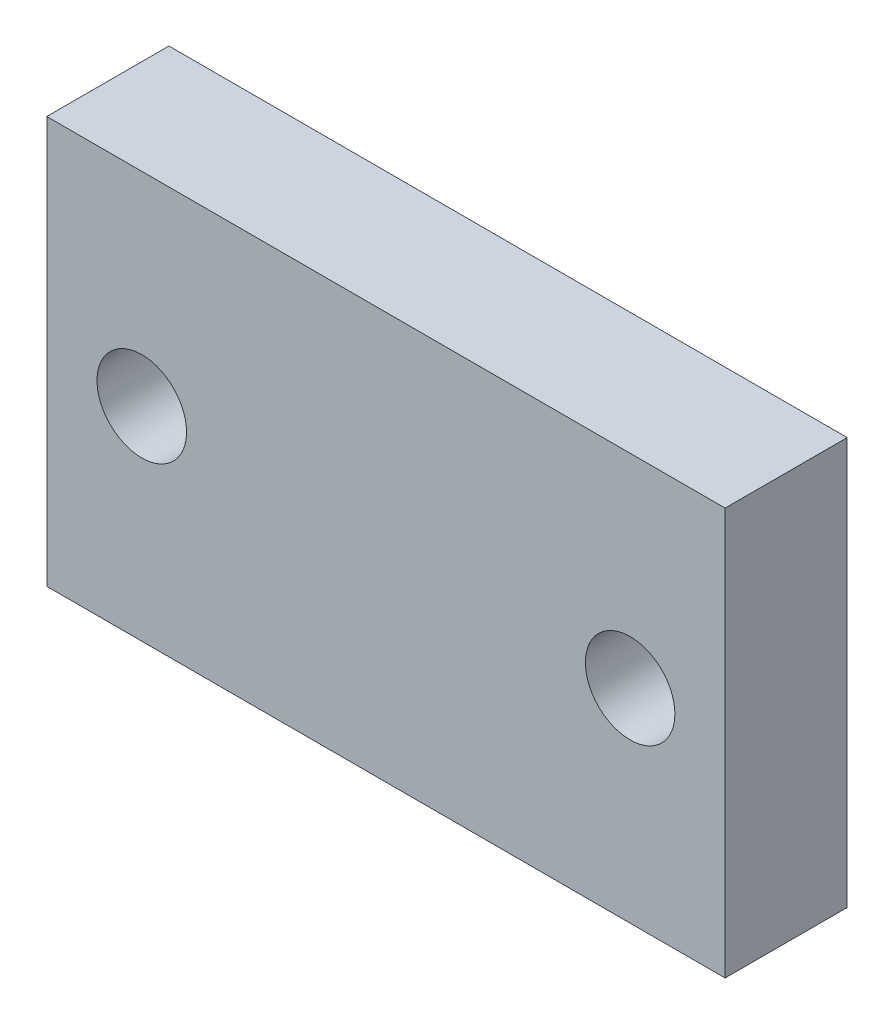
ISO-10303-21;
HEADER;
FILE_DESCRIPTION(('STEP AP214'),'2;1');
FILE_NAME('part.step','',(''),(''),'','','');
FILE_SCHEMA(('AUTOMOTIVE_DESIGN { 1 0 10303 214 1 1 1 1 }'));
ENDSEC;
DATA;
#1=APPLICATION_CONTEXT('core data for automotive mechanical design processes');
#2=APPLICATION_PROTOCOL_DEFINITION('international standard','automotive_design',2000,#1);
#3=PRODUCT_CONTEXT('',#1,'mechanical');
#4=PRODUCT('Part','Part','',(#3));
#5=PRODUCT_RELATED_PRODUCT_CATEGORY('part','',(#4));
#6=PRODUCT_DEFINITION_FORMATION('','',#4);
#7=PRODUCT_DEFINITION_CONTEXT('part definition',#1,'design');
#8=PRODUCT_DEFINITION('design','',#6,#7);
#9=PRODUCT_DEFINITION_SHAPE('','',#8);
#10=(LENGTH_UNIT() NAMED_UNIT(*) SI_UNIT(.MILLI.,.METRE.));
#11=(NAMED_UNIT(*) PLANE_ANGLE_UNIT() SI_UNIT($,.RADIAN.));
#12=(NAMED_UNIT(*) SI_UNIT($,.STERADIAN.) SOLID_ANGLE_UNIT());
#13=UNCERTAINTY_MEASURE_WITH_UNIT(LENGTH_MEASURE(1.E-05),#10,'distance_accuracy_value','');
#14=(GEOMETRIC_REPRESENTATION_CONTEXT(3) GLOBAL_UNCERTAINTY_ASSIGNED_CONTEXT((#13)) GLOBAL_UNIT_ASSIGNED_CONTEXT((#10,
#11,#12)) REPRESENTATION_CONTEXT('',''));
#15=CARTESIAN_POINT('',(0.,0.,0.));
#16=DIRECTION('',(0.,0.,1.));
#17=DIRECTION('',(1.,0.,0.));
#18=AXIS2_PLACEMENT_3D('',#15,#16,#17);
#19=CARTESIAN_POINT('',(0.,0.,9.));
#20=DIRECTION('',(1.,0.,0.));
#21=DIRECTION('',(0.,0.,-1.));
#22=AXIS2_PLACEMENT_3D('',#19,#20,#21);
#23=PLANE('',#22);
#24=DIRECTION('',(0.,-1.,0.));
#25=VECTOR('',#24,1.);
#26=CARTESIAN_POINT('',(0.,0.,0.));
#27=LINE('',#26,#25);
#28=CARTESIAN_POINT('',(0.,30.,0.));
#29=VERTEX_POINT('',#28);
#30=CARTESIAN_POINT('',(0.,0.,0.));
#31=VERTEX_POINT('',#30);
#32=EDGE_CURVE('E98',#29,#31,#27,.T.);
#33=ORIENTED_EDGE('',*,*,#32,.T.);
#34=DIRECTION('',(0.,0.,-1.));
#35=VECTOR('',#34,1.);
#36=CARTESIAN_POINT('',(0.,0.,9.));
#37=LINE('',#36,#35);
#38=CARTESIAN_POINT('',(0.,0.,9.));
#39=VERTEX_POINT('',#38);
#40=EDGE_CURVE('E11',#39,#31,#37,.T.);
#41=ORIENTED_EDGE('',*,*,#40,.F.);
#42=DIRECTION('',(0.,-1.,0.));
#43=VECTOR('',#42,1.);
#44=CARTESIAN_POINT('',(0.,0.,9.));
#45=LINE('',#44,#43);
#46=CARTESIAN_POINT('',(0.,30.,9.));
#47=VERTEX_POINT('',#46);
#48=EDGE_CURVE('E86',#47,#39,#45,.T.);
#49=ORIENTED_EDGE('',*,*,#48,.F.);
#50=DIRECTION('',(0.,0.,-1.));
#51=VECTOR('',#50,1.);
#52=CARTESIAN_POINT('',(0.,30.,9.));
#53=LINE('',#52,#51);
#54=EDGE_CURVE('E94',#47,#29,#53,.T.);
#55=ORIENTED_EDGE('',*,*,#54,.T.);
#56=EDGE_LOOP('',(#33,#41,#49,#55));
#57=FACE_BOUND('',#56,.T.);
#58=ADVANCED_FACE('F35',(#57),#23,.F.);
#59=CARTESIAN_POINT('',(0.,0.,9.));
#60=DIRECTION('',(0.,1.,0.));
#61=DIRECTION('',(0.,0.,1.));
#62=AXIS2_PLACEMENT_3D('',#59,#60,#61);
#63=PLANE('',#62);
#64=DIRECTION('',(1.,0.,0.));
#65=VECTOR('',#64,1.);
#66=CARTESIAN_POINT('',(0.,0.,0.));
#67=LINE('',#66,#65);
#68=CARTESIAN_POINT('',(50.,0.,0.));
#69=VERTEX_POINT('',#68);
#70=EDGE_CURVE('E90',#31,#69,#67,.T.);
#71=ORIENTED_EDGE('',*,*,#70,.T.);
#72=DIRECTION('',(0.,0.,-1.));
#73=VECTOR('',#72,1.);
#74=CARTESIAN_POINT('',(50.,0.,9.));
#75=LINE('',#74,#73);
#76=CARTESIAN_POINT('',(50.,0.,9.));
#77=VERTEX_POINT('',#76);
#78=EDGE_CURVE('E43',#77,#69,#75,.T.);
#79=ORIENTED_EDGE('',*,*,#78,.F.);
#80=DIRECTION('',(1.,0.,0.));
#81=VECTOR('',#80,1.);
#82=CARTESIAN_POINT('',(0.,0.,9.));
#83=LINE('',#82,#81);
#84=EDGE_CURVE('E81',#39,#77,#83,.T.);
#85=ORIENTED_EDGE('',*,*,#84,.F.);
#86=ORIENTED_EDGE('',*,*,#40,.T.);
#87=EDGE_LOOP('',(#71,#79,#85,#86));
#88=FACE_BOUND('',#87,.T.);
#89=ADVANCED_FACE('F89',(#88),#63,.F.);
#90=CARTESIAN_POINT('',(50.,0.,9.));
#91=DIRECTION('',(-1.,0.,0.));
#92=DIRECTION('',(0.,0.,1.));
#93=AXIS2_PLACEMENT_3D('',#90,#91,#92);
#94=PLANE('',#93);
#95=DIRECTION('',(0.,1.,0.));
#96=VECTOR('',#95,1.);
#97=CARTESIAN_POINT('',(50.,0.,0.));
#98=LINE('',#97,#96);
#99=CARTESIAN_POINT('',(50.,30.,0.));
#100=VERTEX_POINT('',#99);
#101=EDGE_CURVE('E68',#69,#100,#98,.T.);
#102=ORIENTED_EDGE('',*,*,#101,.T.);
#103=DIRECTION('',(0.,0.,-1.));
#104=VECTOR('',#103,1.);
#105=CARTESIAN_POINT('',(50.,30.,9.));
#106=LINE('',#105,#104);
#107=CARTESIAN_POINT('',(50.,30.,9.));
#108=VERTEX_POINT('',#107);
#109=EDGE_CURVE('E91',#108,#100,#106,.T.);
#110=ORIENTED_EDGE('',*,*,#109,.F.);
#111=DIRECTION('',(0.,1.,0.));
#112=VECTOR('',#111,1.);
#113=CARTESIAN_POINT('',(50.,0.,9.));
#114=LINE('',#113,#112);
#115=EDGE_CURVE('E84',#77,#108,#114,.T.);
#116=ORIENTED_EDGE('',*,*,#115,.F.);
#117=ORIENTED_EDGE('',*,*,#78,.T.);
#118=EDGE_LOOP('',(#102,#110,#116,#117));
#119=FACE_BOUND('',#118,.T.);
#120=ADVANCED_FACE('F92',(#119),#94,.F.);
#121=CARTESIAN_POINT('',(0.,30.,9.));
#122=DIRECTION('',(0.,-1.,0.));
#123=DIRECTION('',(0.,0.,-1.));
#124=AXIS2_PLACEMENT_3D('',#121,#122,#123);
#125=PLANE('',#124);
#126=DIRECTION('',(-1.,0.,0.));
#127=VECTOR('',#126,1.);
#128=CARTESIAN_POINT('',(0.,30.,0.));
#129=LINE('',#128,#127);
#130=EDGE_CURVE('E74',#100,#29,#129,.T.);
#131=ORIENTED_EDGE('',*,*,#130,.T.);
#132=ORIENTED_EDGE('',*,*,#54,.F.);
#133=DIRECTION('',(-1.,0.,0.));
#134=VECTOR('',#133,1.);
#135=CARTESIAN_POINT('',(0.,30.,9.));
#136=LINE('',#135,#134);
#137=EDGE_CURVE('E51',#108,#47,#136,.T.);
#138=ORIENTED_EDGE('',*,*,#137,.F.);
#139=ORIENTED_EDGE('',*,*,#109,.T.);
#140=EDGE_LOOP('',(#131,#132,#138,#139));
#141=FACE_BOUND('',#140,.T.);
#142=ADVANCED_FACE('F106',(#141),#125,.F.);
#143=CARTESIAN_POINT('',(0.,0.,9.));
#144=DIRECTION('',(0.,0.,-1.));
#145=DIRECTION('',(-1.,0.,0.));
#146=AXIS2_PLACEMENT_3D('',#143,#144,#145);
#147=PLANE('',#146);
#148=CARTESIAN_POINT('',(7.,15.,9.));
#149=DIRECTION('',(0.,0.,1.));
#150=DIRECTION('',(1.,0.,0.));
#151=AXIS2_PLACEMENT_3D('',#148,#149,#150);
#152=CIRCLE('',#151,3.3);
#153=CARTESIAN_POINT('',(10.3,15.,9.));
#154=VERTEX_POINT('',#153);
#155=EDGE_CURVE('E120',#154,#154,#152,.T.);
#156=ORIENTED_EDGE('',*,*,#155,.F.);
#157=EDGE_LOOP('',(#156));
#158=FACE_BOUND('',#157,.T.);
#159=CARTESIAN_POINT('',(43.,15.,9.));
#160=DIRECTION('',(0.,0.,1.));
#161=DIRECTION('',(1.,0.,0.));
#162=AXIS2_PLACEMENT_3D('',#159,#160,#161);
#163=CIRCLE('',#162,3.3);
#164=CARTESIAN_POINT('',(46.3,15.,9.));
#165=VERTEX_POINT('',#164);
#166=EDGE_CURVE('E114',#165,#165,#163,.T.);
#167=ORIENTED_EDGE('',*,*,#166,.F.);
#168=EDGE_LOOP('',(#167));
#169=FACE_BOUND('',#168,.T.);
#170=ORIENTED_EDGE('',*,*,#48,.T.);
#171=ORIENTED_EDGE('',*,*,#84,.T.);
#172=ORIENTED_EDGE('',*,*,#115,.T.);
#173=ORIENTED_EDGE('',*,*,#137,.T.);
#174=EDGE_LOOP('',(#170,#171,#172,#173));
#175=FACE_BOUND('',#174,.T.);
#176=ADVANCED_FACE('F82',(#158,#169,#175),#147,.F.);
#177=CARTESIAN_POINT('',(0.,0.,0.));
#178=DIRECTION('',(0.,0.,-1.));
#179=DIRECTION('',(-1.,0.,0.));
#180=AXIS2_PLACEMENT_3D('',#177,#178,#179);
#181=PLANE('',#180);
#182=CARTESIAN_POINT('',(7.,15.,0.));
#183=DIRECTION('',(0.,0.,1.));
#184=DIRECTION('',(1.,0.,0.));
#185=AXIS2_PLACEMENT_3D('',#182,#183,#184);
#186=CIRCLE('',#185,3.3);
#187=CARTESIAN_POINT('',(10.3,15.,0.));
#188=VERTEX_POINT('',#187);
#189=EDGE_CURVE('E117',#188,#188,#186,.T.);
#190=ORIENTED_EDGE('',*,*,#189,.T.);
#191=EDGE_LOOP('',(#190));
#192=FACE_BOUND('',#191,.T.);
#193=CARTESIAN_POINT('',(43.,15.,0.));
#194=DIRECTION('',(0.,0.,1.));
#195=DIRECTION('',(1.,0.,0.));
#196=AXIS2_PLACEMENT_3D('',#193,#194,#195);
#197=CIRCLE('',#196,3.3);
#198=CARTESIAN_POINT('',(46.3,15.,0.));
#199=VERTEX_POINT('',#198);
#200=EDGE_CURVE('E101',#199,#199,#197,.T.);
#201=ORIENTED_EDGE('',*,*,#200,.T.);
#202=EDGE_LOOP('',(#201));
#203=FACE_BOUND('',#202,.T.);
#204=ORIENTED_EDGE('',*,*,#32,.F.);
#205=ORIENTED_EDGE('',*,*,#130,.F.);
#206=ORIENTED_EDGE('',*,*,#101,.F.);
#207=ORIENTED_EDGE('',*,*,#70,.F.);
#208=EDGE_LOOP('',(#204,#205,#206,#207));
#209=FACE_BOUND('',#208,.T.);
#210=ADVANCED_FACE('F109',(#192,#203,#209),#181,.T.);
#211=CARTESIAN_POINT('',(43.,15.,9.));
#212=DIRECTION('',(0.,0.,1.));
#213=DIRECTION('',(1.,0.,0.));
#214=AXIS2_PLACEMENT_3D('',#211,#212,#213);
#215=CYLINDRICAL_SURFACE('',#214,3.3);
#216=ORIENTED_EDGE('',*,*,#200,.F.);
#217=EDGE_LOOP('',(#216));
#218=FACE_BOUND('',#217,.T.);
#219=ORIENTED_EDGE('',*,*,#166,.T.);
#220=EDGE_LOOP('',(#219));
#221=FACE_BOUND('',#220,.T.);
#222=ADVANCED_FACE('F131',(#218,#221),#215,.F.);
#223=CARTESIAN_POINT('',(7.,15.,9.));
#224=DIRECTION('',(0.,0.,1.));
#225=DIRECTION('',(1.,0.,0.));
#226=AXIS2_PLACEMENT_3D('',#223,#224,#225);
#227=CYLINDRICAL_SURFACE('',#226,3.3);
#228=ORIENTED_EDGE('',*,*,#189,.F.);
#229=EDGE_LOOP('',(#228));
#230=FACE_BOUND('',#229,.T.);
#231=ORIENTED_EDGE('',*,*,#155,.T.);
#232=EDGE_LOOP('',(#231));
#233=FACE_BOUND('',#232,.T.);
#234=ADVANCED_FACE('F124',(#230,#233),#227,.F.);
#235=CLOSED_SHELL('',(#58,#89,#120,#142,#176,#210,#222,#234));
#236=MANIFOLD_SOLID_BREP('B2',#235);
#237=ADVANCED_BREP_SHAPE_REPRESENTATION('',(#18,#236),#14);
#238=SHAPE_DEFINITION_REPRESENTATION(#9,#237);
ENDSEC;
END-ISO-10303-21;
